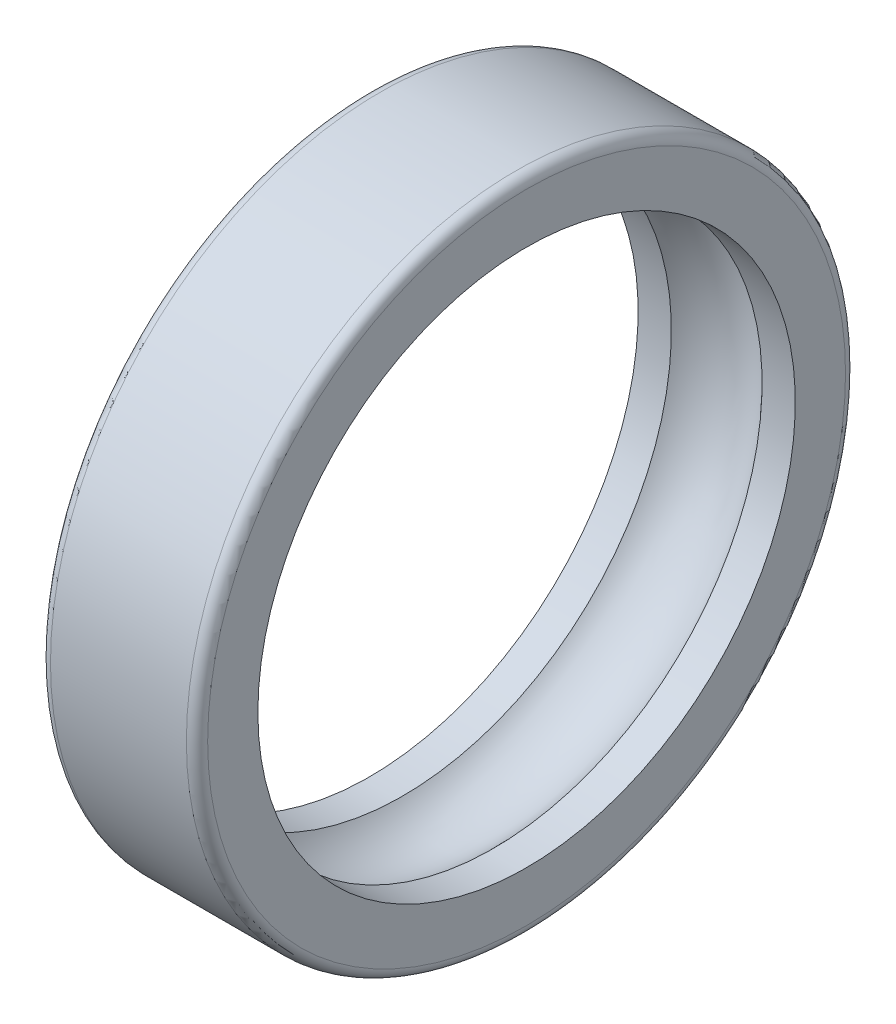
ISO-10303-21;
HEADER;
FILE_DESCRIPTION(('STEP AP214'),'2;1');
FILE_NAME('part.step','',(''),(''),'','','');
FILE_SCHEMA(('AUTOMOTIVE_DESIGN { 1 0 10303 214 1 1 1 1 }'));
ENDSEC;
DATA;
#1=APPLICATION_CONTEXT('core data for automotive mechanical design processes');
#2=APPLICATION_PROTOCOL_DEFINITION('international standard','automotive_design',2000,#1);
#3=PRODUCT_CONTEXT('',#1,'mechanical');
#4=PRODUCT('Part','Part','',(#3));
#5=PRODUCT_RELATED_PRODUCT_CATEGORY('part','',(#4));
#6=PRODUCT_DEFINITION_FORMATION('','',#4);
#7=PRODUCT_DEFINITION_CONTEXT('part definition',#1,'design');
#8=PRODUCT_DEFINITION('design','',#6,#7);
#9=PRODUCT_DEFINITION_SHAPE('','',#8);
#10=(LENGTH_UNIT() NAMED_UNIT(*) SI_UNIT(.MILLI.,.METRE.));
#11=(NAMED_UNIT(*) PLANE_ANGLE_UNIT() SI_UNIT($,.RADIAN.));
#12=(NAMED_UNIT(*) SI_UNIT($,.STERADIAN.) SOLID_ANGLE_UNIT());
#13=UNCERTAINTY_MEASURE_WITH_UNIT(LENGTH_MEASURE(1.E-05),#10,'distance_accuracy_value','');
#14=(GEOMETRIC_REPRESENTATION_CONTEXT(3) GLOBAL_UNCERTAINTY_ASSIGNED_CONTEXT((#13)) GLOBAL_UNIT_ASSIGNED_CONTEXT((#10,
#11,#12)) REPRESENTATION_CONTEXT('',''));
#15=CARTESIAN_POINT('',(0.,0.,0.));
#16=DIRECTION('',(0.,0.,1.));
#17=DIRECTION('',(1.,0.,0.));
#18=AXIS2_PLACEMENT_3D('',#15,#16,#17);
#19=CARTESIAN_POINT('',(15.5,53.,0.));
#20=DIRECTION('',(-1.,0.,0.));
#21=DIRECTION('',(0.,0.,1.));
#22=AXIS2_PLACEMENT_3D('',#19,#20,#21);
#23=PLANE('',#22);
#24=CARTESIAN_POINT('',(15.5,0.,0.));
#25=DIRECTION('',(-1.,0.,0.));
#26=DIRECTION('',(0.,0.,1.));
#27=AXIS2_PLACEMENT_3D('',#24,#25,#26);
#28=CIRCLE('',#27,62.9);
#29=CARTESIAN_POINT('',(15.5,0.,62.9));
#30=VERTEX_POINT('',#29);
#31=EDGE_CURVE('E48',#30,#30,#28,.F.);
#32=ORIENTED_EDGE('',*,*,#31,.T.);
#33=EDGE_LOOP('',(#32));
#34=FACE_BOUND('',#33,.T.);
#35=CARTESIAN_POINT('',(15.5,0.,0.));
#36=DIRECTION('',(-1.,0.,0.));
#37=DIRECTION('',(0.,0.,1.));
#38=AXIS2_PLACEMENT_3D('',#35,#36,#37);
#39=CIRCLE('',#38,53.);
#40=CARTESIAN_POINT('',(15.5,0.,53.));
#41=VERTEX_POINT('',#40);
#42=EDGE_CURVE('E61',#41,#41,#39,.T.);
#43=ORIENTED_EDGE('',*,*,#42,.T.);
#44=EDGE_LOOP('',(#43));
#45=FACE_BOUND('',#44,.T.);
#46=ADVANCED_FACE('F41',(#34,#45),#23,.F.);
#47=CARTESIAN_POINT('',(-15.5319587628866,0.,0.));
#48=DIRECTION('',(-1.,0.,0.));
#49=DIRECTION('',(0.,0.,1.));
#50=AXIS2_PLACEMENT_3D('',#47,#48,#49);
#51=CYLINDRICAL_SURFACE('',#50,53.);
#52=ORIENTED_EDGE('',*,*,#42,.F.);
#53=EDGE_LOOP('',(#52));
#54=FACE_BOUND('',#53,.T.);
#55=CARTESIAN_POINT('',(8.94427190999916,0.,0.));
#56=DIRECTION('',(-1.,0.,0.));
#57=DIRECTION('',(0.,0.,1.));
#58=AXIS2_PLACEMENT_3D('',#55,#56,#57);
#59=CIRCLE('',#58,53.);
#60=CARTESIAN_POINT('',(8.94427190999916,0.,53.));
#61=VERTEX_POINT('',#60);
#62=EDGE_CURVE('E64',#61,#61,#59,.T.);
#63=ORIENTED_EDGE('',*,*,#62,.T.);
#64=EDGE_LOOP('',(#63));
#65=FACE_BOUND('',#64,.T.);
#66=ADVANCED_FACE('F91',(#54,#65),#51,.F.);
#67=CARTESIAN_POINT('',(0.,0.,0.));
#68=DIRECTION('',(-1.,0.,0.));
#69=DIRECTION('',(0.,0.,1.));
#70=AXIS2_PLACEMENT_3D('',#67,#68,#69);
#71=TOROIDAL_SURFACE('',#70,45.,12.);
#72=ORIENTED_EDGE('',*,*,#62,.F.);
#73=EDGE_LOOP('',(#72));
#74=FACE_BOUND('',#73,.T.);
#75=CARTESIAN_POINT('',(-8.94427190999916,0.,0.));
#76=DIRECTION('',(-1.,0.,0.));
#77=DIRECTION('',(0.,0.,1.));
#78=AXIS2_PLACEMENT_3D('',#75,#76,#77);
#79=CIRCLE('',#78,53.);
#80=CARTESIAN_POINT('',(-8.94427190999916,0.,53.));
#81=VERTEX_POINT('',#80);
#82=EDGE_CURVE('E67',#81,#81,#79,.T.);
#83=ORIENTED_EDGE('',*,*,#82,.T.);
#84=EDGE_LOOP('',(#83));
#85=FACE_BOUND('',#84,.T.);
#86=ADVANCED_FACE('F88',(#74,#85),#71,.F.);
#87=CARTESIAN_POINT('',(-15.5319587628866,0.,0.));
#88=DIRECTION('',(-1.,0.,0.));
#89=DIRECTION('',(0.,0.,1.));
#90=AXIS2_PLACEMENT_3D('',#87,#88,#89);
#91=CYLINDRICAL_SURFACE('',#90,53.);
#92=ORIENTED_EDGE('',*,*,#82,.F.);
#93=EDGE_LOOP('',(#92));
#94=FACE_BOUND('',#93,.T.);
#95=CARTESIAN_POINT('',(-15.5,0.,0.));
#96=DIRECTION('',(-1.,0.,0.));
#97=DIRECTION('',(0.,0.,1.));
#98=AXIS2_PLACEMENT_3D('',#95,#96,#97);
#99=CIRCLE('',#98,53.);
#100=CARTESIAN_POINT('',(-15.5,0.,53.));
#101=VERTEX_POINT('',#100);
#102=EDGE_CURVE('E70',#101,#101,#99,.T.);
#103=ORIENTED_EDGE('',*,*,#102,.T.);
#104=EDGE_LOOP('',(#103));
#105=FACE_BOUND('',#104,.T.);
#106=ADVANCED_FACE('F74',(#94,#105),#91,.F.);
#107=CARTESIAN_POINT('',(-15.5,53.,0.));
#108=DIRECTION('',(1.,0.,0.));
#109=DIRECTION('',(0.,0.,-1.));
#110=AXIS2_PLACEMENT_3D('',#107,#108,#109);
#111=PLANE('',#110);
#112=CARTESIAN_POINT('',(-15.5,0.,0.));
#113=DIRECTION('',(1.,0.,0.));
#114=DIRECTION('',(0.,0.,-1.));
#115=AXIS2_PLACEMENT_3D('',#112,#113,#114);
#116=CIRCLE('',#115,62.9);
#117=CARTESIAN_POINT('',(-15.5,0.,-62.9));
#118=VERTEX_POINT('',#117);
#119=EDGE_CURVE('E10',#118,#118,#116,.F.);
#120=ORIENTED_EDGE('',*,*,#119,.T.);
#121=EDGE_LOOP('',(#120));
#122=FACE_BOUND('',#121,.T.);
#123=ORIENTED_EDGE('',*,*,#102,.F.);
#124=EDGE_LOOP('',(#123));
#125=FACE_BOUND('',#124,.T.);
#126=ADVANCED_FACE('F76',(#122,#125),#111,.F.);
#127=CARTESIAN_POINT('',(-15.5319587628866,0.,0.));
#128=DIRECTION('',(-1.,0.,0.));
#129=DIRECTION('',(0.,0.,1.));
#130=AXIS2_PLACEMENT_3D('',#127,#128,#129);
#131=CYLINDRICAL_SURFACE('',#130,65.);
#132=CARTESIAN_POINT('',(13.4,0.,0.));
#133=DIRECTION('',(-1.,0.,0.));
#134=DIRECTION('',(0.,0.,1.));
#135=AXIS2_PLACEMENT_3D('',#132,#133,#134);
#136=CIRCLE('',#135,65.);
#137=CARTESIAN_POINT('',(13.4,0.,65.));
#138=VERTEX_POINT('',#137);
#139=EDGE_CURVE('E52',#138,#138,#136,.T.);
#140=ORIENTED_EDGE('',*,*,#139,.T.);
#141=EDGE_LOOP('',(#140));
#142=FACE_BOUND('',#141,.T.);
#143=CARTESIAN_POINT('',(-13.4,0.,0.));
#144=DIRECTION('',(1.,0.,0.));
#145=DIRECTION('',(0.,0.,-1.));
#146=AXIS2_PLACEMENT_3D('',#143,#144,#145);
#147=CIRCLE('',#146,65.);
#148=CARTESIAN_POINT('',(-13.4,0.,-65.));
#149=VERTEX_POINT('',#148);
#150=EDGE_CURVE('E56',#149,#149,#147,.T.);
#151=ORIENTED_EDGE('',*,*,#150,.T.);
#152=EDGE_LOOP('',(#151));
#153=FACE_BOUND('',#152,.T.);
#154=ADVANCED_FACE('F78',(#142,#153),#131,.T.);
#155=CARTESIAN_POINT('',(13.4,0.,0.));
#156=DIRECTION('',(-1.,0.,0.));
#157=DIRECTION('',(0.,0.,1.));
#158=AXIS2_PLACEMENT_3D('',#155,#156,#157);
#159=TOROIDAL_SURFACE('',#158,62.9,2.1);
#160=ORIENTED_EDGE('',*,*,#31,.F.);
#161=EDGE_LOOP('',(#160));
#162=FACE_BOUND('',#161,.T.);
#163=ORIENTED_EDGE('',*,*,#139,.F.);
#164=EDGE_LOOP('',(#163));
#165=FACE_BOUND('',#164,.T.);
#166=ADVANCED_FACE('F84',(#162,#165),#159,.T.);
#167=CARTESIAN_POINT('',(-13.4,0.,0.));
#168=DIRECTION('',(1.,0.,0.));
#169=DIRECTION('',(0.,0.,-1.));
#170=AXIS2_PLACEMENT_3D('',#167,#168,#169);
#171=TOROIDAL_SURFACE('',#170,62.9,2.1);
#172=ORIENTED_EDGE('',*,*,#150,.F.);
#173=EDGE_LOOP('',(#172));
#174=FACE_BOUND('',#173,.T.);
#175=ORIENTED_EDGE('',*,*,#119,.F.);
#176=EDGE_LOOP('',(#175));
#177=FACE_BOUND('',#176,.T.);
#178=ADVANCED_FACE('F43',(#174,#177),#171,.T.);
#179=CLOSED_SHELL('',(#46,#66,#86,#106,#126,#154,#166,#178));
#180=MANIFOLD_SOLID_BREP('B2',#179);
#181=ADVANCED_BREP_SHAPE_REPRESENTATION('',(#18,#180),#14);
#182=SHAPE_DEFINITION_REPRESENTATION(#9,#181);
ENDSEC;
END-ISO-10303-21;
